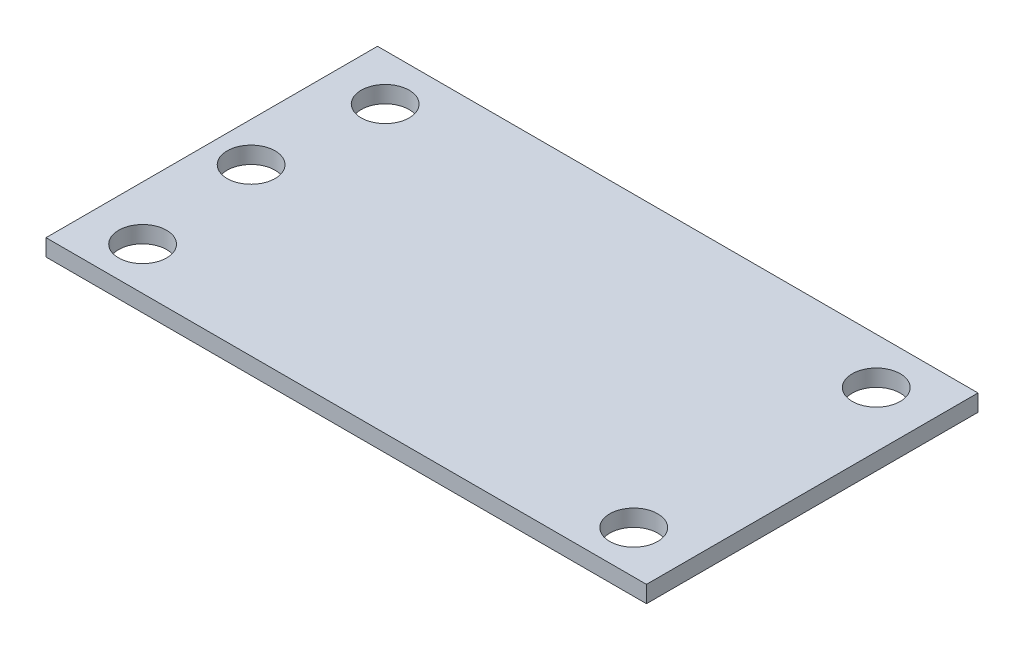
ISO-10303-21;
HEADER;
FILE_DESCRIPTION(('STEP AP214'),'2;1');
FILE_NAME('part.step','',(''),(''),'','','');
FILE_SCHEMA(('AUTOMOTIVE_DESIGN { 1 0 10303 214 1 1 1 1 }'));
ENDSEC;
DATA;
#1=APPLICATION_CONTEXT('core data for automotive mechanical design processes');
#2=APPLICATION_PROTOCOL_DEFINITION('international standard','automotive_design',2000,#1);
#3=PRODUCT_CONTEXT('',#1,'mechanical');
#4=PRODUCT('Part','Part','',(#3));
#5=PRODUCT_RELATED_PRODUCT_CATEGORY('part','',(#4));
#6=PRODUCT_DEFINITION_FORMATION('','',#4);
#7=PRODUCT_DEFINITION_CONTEXT('part definition',#1,'design');
#8=PRODUCT_DEFINITION('design','',#6,#7);
#9=PRODUCT_DEFINITION_SHAPE('','',#8);
#10=(LENGTH_UNIT() NAMED_UNIT(*) SI_UNIT(.MILLI.,.METRE.));
#11=(NAMED_UNIT(*) PLANE_ANGLE_UNIT() SI_UNIT($,.RADIAN.));
#12=(NAMED_UNIT(*) SI_UNIT($,.STERADIAN.) SOLID_ANGLE_UNIT());
#13=UNCERTAINTY_MEASURE_WITH_UNIT(LENGTH_MEASURE(1.E-05),#10,'distance_accuracy_value','');
#14=(GEOMETRIC_REPRESENTATION_CONTEXT(3) GLOBAL_UNCERTAINTY_ASSIGNED_CONTEXT((#13)) GLOBAL_UNIT_ASSIGNED_CONTEXT((#10,
#11,#12)) REPRESENTATION_CONTEXT('',''));
#15=CARTESIAN_POINT('',(0.,0.,0.));
#16=DIRECTION('',(0.,0.,1.));
#17=DIRECTION('',(1.,0.,0.));
#18=AXIS2_PLACEMENT_3D('',#15,#16,#17);
#19=CARTESIAN_POINT('',(-125.131661341035,6.99999999999999,-69.0846657224159));
#20=DIRECTION('',(1.,0.,0.));
#21=DIRECTION('',(0.,0.,-1.));
#22=AXIS2_PLACEMENT_3D('',#19,#20,#21);
#23=PLANE('',#22);
#24=DIRECTION('',(0.,0.,1.));
#25=VECTOR('',#24,1.);
#26=CARTESIAN_POINT('',(-125.131661341035,0.,-69.0846657224159));
#27=LINE('',#26,#25);
#28=CARTESIAN_POINT('',(-125.131661341035,0.,-69.0846657224159));
#29=VERTEX_POINT('',#28);
#30=CARTESIAN_POINT('',(-125.131661341035,0.,69.0846657224159));
#31=VERTEX_POINT('',#30);
#32=EDGE_CURVE('E114',#29,#31,#27,.T.);
#33=ORIENTED_EDGE('',*,*,#32,.T.);
#34=DIRECTION('',(0.,-1.,0.));
#35=VECTOR('',#34,1.);
#36=CARTESIAN_POINT('',(-125.131661341035,6.99999999999999,69.0846657224159));
#37=LINE('',#36,#35);
#38=CARTESIAN_POINT('',(-125.131661341035,6.99999999999999,69.0846657224159));
#39=VERTEX_POINT('',#38);
#40=EDGE_CURVE('E11',#39,#31,#37,.T.);
#41=ORIENTED_EDGE('',*,*,#40,.F.);
#42=DIRECTION('',(0.,0.,1.));
#43=VECTOR('',#42,1.);
#44=CARTESIAN_POINT('',(-125.131661341035,6.99999999999999,-69.0846657224159));
#45=LINE('',#44,#43);
#46=CARTESIAN_POINT('',(-125.131661341035,6.99999999999999,-69.0846657224159));
#47=VERTEX_POINT('',#46);
#48=EDGE_CURVE('E97',#47,#39,#45,.T.);
#49=ORIENTED_EDGE('',*,*,#48,.F.);
#50=DIRECTION('',(0.,-1.,0.));
#51=VECTOR('',#50,1.);
#52=CARTESIAN_POINT('',(-125.131661341035,6.99999999999999,-69.0846657224159));
#53=LINE('',#52,#51);
#54=EDGE_CURVE('E110',#47,#29,#53,.T.);
#55=ORIENTED_EDGE('',*,*,#54,.T.);
#56=EDGE_LOOP('',(#33,#41,#49,#55));
#57=FACE_BOUND('',#56,.T.);
#58=ADVANCED_FACE('F43',(#57),#23,.F.);
#59=CARTESIAN_POINT('',(125.131661341035,6.99999999999999,69.0846657224159));
#60=DIRECTION('',(0.,0.,-1.));
#61=DIRECTION('',(-1.,0.,0.));
#62=AXIS2_PLACEMENT_3D('',#59,#60,#61);
#63=PLANE('',#62);
#64=DIRECTION('',(1.,0.,0.));
#65=VECTOR('',#64,1.);
#66=CARTESIAN_POINT('',(125.131661341035,0.,69.0846657224159));
#67=LINE('',#66,#65);
#68=CARTESIAN_POINT('',(125.131661341035,0.,69.0846657224159));
#69=VERTEX_POINT('',#68);
#70=EDGE_CURVE('E102',#31,#69,#67,.T.);
#71=ORIENTED_EDGE('',*,*,#70,.T.);
#72=DIRECTION('',(0.,-1.,0.));
#73=VECTOR('',#72,1.);
#74=CARTESIAN_POINT('',(125.131661341035,6.99999999999999,69.0846657224159));
#75=LINE('',#74,#73);
#76=CARTESIAN_POINT('',(125.131661341035,6.99999999999999,69.0846657224159));
#77=VERTEX_POINT('',#76);
#78=EDGE_CURVE('E53',#77,#69,#75,.T.);
#79=ORIENTED_EDGE('',*,*,#78,.F.);
#80=DIRECTION('',(1.,0.,0.));
#81=VECTOR('',#80,1.);
#82=CARTESIAN_POINT('',(125.131661341035,6.99999999999999,69.0846657224159));
#83=LINE('',#82,#81);
#84=EDGE_CURVE('E92',#39,#77,#83,.T.);
#85=ORIENTED_EDGE('',*,*,#84,.F.);
#86=ORIENTED_EDGE('',*,*,#40,.T.);
#87=EDGE_LOOP('',(#71,#79,#85,#86));
#88=FACE_BOUND('',#87,.T.);
#89=ADVANCED_FACE('F101',(#88),#63,.F.);
#90=CARTESIAN_POINT('',(125.131661341035,6.99999999999999,-69.0846657224159));
#91=DIRECTION('',(-1.,0.,0.));
#92=DIRECTION('',(0.,0.,1.));
#93=AXIS2_PLACEMENT_3D('',#90,#91,#92);
#94=PLANE('',#93);
#95=DIRECTION('',(0.,0.,-1.));
#96=VECTOR('',#95,1.);
#97=CARTESIAN_POINT('',(125.131661341035,0.,-69.0846657224159));
#98=LINE('',#97,#96);
#99=CARTESIAN_POINT('',(125.131661341035,0.,-69.0846657224159));
#100=VERTEX_POINT('',#99);
#101=EDGE_CURVE('E79',#69,#100,#98,.T.);
#102=ORIENTED_EDGE('',*,*,#101,.T.);
#103=DIRECTION('',(0.,-1.,0.));
#104=VECTOR('',#103,1.);
#105=CARTESIAN_POINT('',(125.131661341035,6.99999999999999,-69.0846657224159));
#106=LINE('',#105,#104);
#107=CARTESIAN_POINT('',(125.131661341035,6.99999999999999,-69.0846657224159));
#108=VERTEX_POINT('',#107);
#109=EDGE_CURVE('E104',#108,#100,#106,.T.);
#110=ORIENTED_EDGE('',*,*,#109,.F.);
#111=DIRECTION('',(0.,0.,-1.));
#112=VECTOR('',#111,1.);
#113=CARTESIAN_POINT('',(125.131661341035,6.99999999999999,-69.0846657224159));
#114=LINE('',#113,#112);
#115=EDGE_CURVE('E95',#77,#108,#114,.T.);
#116=ORIENTED_EDGE('',*,*,#115,.F.);
#117=ORIENTED_EDGE('',*,*,#78,.T.);
#118=EDGE_LOOP('',(#102,#110,#116,#117));
#119=FACE_BOUND('',#118,.T.);
#120=ADVANCED_FACE('F106',(#119),#94,.F.);
#121=CARTESIAN_POINT('',(125.131661341035,6.99999999999999,-69.0846657224159));
#122=DIRECTION('',(0.,0.,1.));
#123=DIRECTION('',(1.,0.,0.));
#124=AXIS2_PLACEMENT_3D('',#121,#122,#123);
#125=PLANE('',#124);
#126=DIRECTION('',(-1.,0.,0.));
#127=VECTOR('',#126,1.);
#128=CARTESIAN_POINT('',(125.131661341035,0.,-69.0846657224159));
#129=LINE('',#128,#127);
#130=EDGE_CURVE('E85',#100,#29,#129,.T.);
#131=ORIENTED_EDGE('',*,*,#130,.T.);
#132=ORIENTED_EDGE('',*,*,#54,.F.);
#133=DIRECTION('',(-1.,0.,0.));
#134=VECTOR('',#133,1.);
#135=CARTESIAN_POINT('',(125.131661341035,6.99999999999999,-69.0846657224159));
#136=LINE('',#135,#134);
#137=EDGE_CURVE('E62',#108,#47,#136,.T.);
#138=ORIENTED_EDGE('',*,*,#137,.F.);
#139=ORIENTED_EDGE('',*,*,#109,.T.);
#140=EDGE_LOOP('',(#131,#132,#138,#139));
#141=FACE_BOUND('',#140,.T.);
#142=ADVANCED_FACE('F203',(#141),#125,.F.);
#143=CARTESIAN_POINT('',(0.,6.99999999999999,0.));
#144=DIRECTION('',(0.,-1.,0.));
#145=DIRECTION('',(0.,0.,-1.));
#146=AXIS2_PLACEMENT_3D('',#143,#144,#145);
#147=PLANE('',#146);
#148=CARTESIAN_POINT('',(-108.726788050302,6.99999999999999,0.));
#149=DIRECTION('',(0.,-1.,0.));
#150=DIRECTION('',(0.,0.,-1.));
#151=AXIS2_PLACEMENT_3D('',#148,#149,#150);
#152=CIRCLE('',#151,9.99999999999999);
#153=CARTESIAN_POINT('',(-108.726788050302,6.99999999999999,-9.99999999999999));
#154=VERTEX_POINT('',#153);
#155=EDGE_CURVE('E134',#154,#154,#152,.F.);
#156=ORIENTED_EDGE('',*,*,#155,.F.);
#157=EDGE_LOOP('',(#156));
#158=FACE_BOUND('',#157,.T.);
#159=CARTESIAN_POINT('',(-102.685331177245,6.99999999999999,51.2636376190876));
#160=DIRECTION('',(0.,-1.,0.));
#161=DIRECTION('',(0.,0.,-1.));
#162=AXIS2_PLACEMENT_3D('',#159,#160,#161);
#163=CIRCLE('',#162,9.99999999999999);
#164=CARTESIAN_POINT('',(-102.685331177245,6.99999999999999,41.2636376190876));
#165=VERTEX_POINT('',#164);
#166=EDGE_CURVE('E118',#165,#165,#163,.F.);
#167=ORIENTED_EDGE('',*,*,#166,.F.);
#168=EDGE_LOOP('',(#167));
#169=FACE_BOUND('',#168,.T.);
#170=CARTESIAN_POINT('',(101.994027262382,6.99999999999999,51.2636376190876));
#171=DIRECTION('',(0.,-1.,0.));
#172=DIRECTION('',(0.,0.,-1.));
#173=AXIS2_PLACEMENT_3D('',#170,#171,#172);
#174=CIRCLE('',#173,9.99999999999999);
#175=CARTESIAN_POINT('',(101.994027262382,6.99999999999999,41.2636376190876));
#176=VERTEX_POINT('',#175);
#177=EDGE_CURVE('E143',#176,#176,#174,.F.);
#178=ORIENTED_EDGE('',*,*,#177,.F.);
#179=EDGE_LOOP('',(#178));
#180=FACE_BOUND('',#179,.T.);
#181=CARTESIAN_POINT('',(101.994027262382,6.99999999999999,-49.826038164123));
#182=DIRECTION('',(0.,-1.,0.));
#183=DIRECTION('',(0.,0.,-1.));
#184=AXIS2_PLACEMENT_3D('',#181,#182,#183);
#185=CIRCLE('',#184,9.99999999999999);
#186=CARTESIAN_POINT('',(101.994027262382,6.99999999999999,-59.826038164123));
#187=VERTEX_POINT('',#186);
#188=EDGE_CURVE('E139',#187,#187,#185,.F.);
#189=ORIENTED_EDGE('',*,*,#188,.F.);
#190=EDGE_LOOP('',(#189));
#191=FACE_BOUND('',#190,.T.);
#192=CARTESIAN_POINT('',(-102.685331177245,6.99999999999999,-49.826038164123));
#193=DIRECTION('',(0.,-1.,0.));
#194=DIRECTION('',(0.,0.,-1.));
#195=AXIS2_PLACEMENT_3D('',#192,#193,#194);
#196=CIRCLE('',#195,9.99999999999999);
#197=CARTESIAN_POINT('',(-102.685331177245,6.99999999999999,-59.826038164123));
#198=VERTEX_POINT('',#197);
#199=EDGE_CURVE('E133',#198,#198,#196,.F.);
#200=ORIENTED_EDGE('',*,*,#199,.F.);
#201=EDGE_LOOP('',(#200));
#202=FACE_BOUND('',#201,.T.);
#203=ORIENTED_EDGE('',*,*,#48,.T.);
#204=ORIENTED_EDGE('',*,*,#84,.T.);
#205=ORIENTED_EDGE('',*,*,#115,.T.);
#206=ORIENTED_EDGE('',*,*,#137,.T.);
#207=EDGE_LOOP('',(#203,#204,#205,#206));
#208=FACE_BOUND('',#207,.T.);
#209=ADVANCED_FACE('F93',(#158,#169,#180,#191,#202,#208),#147,.F.);
#210=CARTESIAN_POINT('',(0.,0.,0.));
#211=DIRECTION('',(0.,-1.,0.));
#212=DIRECTION('',(0.,0.,-1.));
#213=AXIS2_PLACEMENT_3D('',#210,#211,#212);
#214=PLANE('',#213);
#215=CARTESIAN_POINT('',(-108.726788050302,0.,0.));
#216=DIRECTION('',(0.,-1.,0.));
#217=DIRECTION('',(0.,0.,-1.));
#218=AXIS2_PLACEMENT_3D('',#215,#216,#217);
#219=CIRCLE('',#218,9.99999999999999);
#220=CARTESIAN_POINT('',(-108.726788050302,0.,-9.99999999999999));
#221=VERTEX_POINT('',#220);
#222=EDGE_CURVE('E46',#221,#221,#219,.F.);
#223=ORIENTED_EDGE('',*,*,#222,.T.);
#224=EDGE_LOOP('',(#223));
#225=FACE_BOUND('',#224,.T.);
#226=CARTESIAN_POINT('',(-102.685331177245,0.,51.2636376190876));
#227=DIRECTION('',(0.,-1.,0.));
#228=DIRECTION('',(0.,0.,-1.));
#229=AXIS2_PLACEMENT_3D('',#226,#227,#228);
#230=CIRCLE('',#229,9.99999999999999);
#231=CARTESIAN_POINT('',(-102.685331177245,0.,41.2636376190876));
#232=VERTEX_POINT('',#231);
#233=EDGE_CURVE('E144',#232,#232,#230,.F.);
#234=ORIENTED_EDGE('',*,*,#233,.T.);
#235=EDGE_LOOP('',(#234));
#236=FACE_BOUND('',#235,.T.);
#237=CARTESIAN_POINT('',(101.994027262382,0.,51.2636376190876));
#238=DIRECTION('',(0.,-1.,0.));
#239=DIRECTION('',(0.,0.,-1.));
#240=AXIS2_PLACEMENT_3D('',#237,#238,#239);
#241=CIRCLE('',#240,9.99999999999999);
#242=CARTESIAN_POINT('',(101.994027262382,0.,41.2636376190876));
#243=VERTEX_POINT('',#242);
#244=EDGE_CURVE('E140',#243,#243,#241,.F.);
#245=ORIENTED_EDGE('',*,*,#244,.T.);
#246=EDGE_LOOP('',(#245));
#247=FACE_BOUND('',#246,.T.);
#248=CARTESIAN_POINT('',(101.994027262382,0.,-49.826038164123));
#249=DIRECTION('',(0.,-1.,0.));
#250=DIRECTION('',(0.,0.,-1.));
#251=AXIS2_PLACEMENT_3D('',#248,#249,#250);
#252=CIRCLE('',#251,9.99999999999999);
#253=CARTESIAN_POINT('',(101.994027262382,0.,-59.826038164123));
#254=VERTEX_POINT('',#253);
#255=EDGE_CURVE('E135',#254,#254,#252,.F.);
#256=ORIENTED_EDGE('',*,*,#255,.T.);
#257=EDGE_LOOP('',(#256));
#258=FACE_BOUND('',#257,.T.);
#259=CARTESIAN_POINT('',(-102.685331177245,0.,-49.826038164123));
#260=DIRECTION('',(0.,-1.,0.));
#261=DIRECTION('',(0.,0.,-1.));
#262=AXIS2_PLACEMENT_3D('',#259,#260,#261);
#263=CIRCLE('',#262,9.99999999999999);
#264=CARTESIAN_POINT('',(-102.685331177245,0.,-59.826038164123));
#265=VERTEX_POINT('',#264);
#266=EDGE_CURVE('E129',#265,#265,#263,.F.);
#267=ORIENTED_EDGE('',*,*,#266,.T.);
#268=EDGE_LOOP('',(#267));
#269=FACE_BOUND('',#268,.T.);
#270=ORIENTED_EDGE('',*,*,#32,.F.);
#271=ORIENTED_EDGE('',*,*,#130,.F.);
#272=ORIENTED_EDGE('',*,*,#101,.F.);
#273=ORIENTED_EDGE('',*,*,#70,.F.);
#274=EDGE_LOOP('',(#270,#271,#272,#273));
#275=FACE_BOUND('',#274,.T.);
#276=ADVANCED_FACE('F173',(#225,#236,#247,#258,#269,#275),#214,.T.);
#277=CARTESIAN_POINT('',(-102.685331177245,60.,-49.826038164123));
#278=DIRECTION('',(0.,-1.,0.));
#279=DIRECTION('',(0.,0.,-1.));
#280=AXIS2_PLACEMENT_3D('',#277,#278,#279);
#281=CYLINDRICAL_SURFACE('',#280,9.99999999999999);
#282=ORIENTED_EDGE('',*,*,#266,.F.);
#283=EDGE_LOOP('',(#282));
#284=FACE_BOUND('',#283,.T.);
#285=ORIENTED_EDGE('',*,*,#199,.T.);
#286=EDGE_LOOP('',(#285));
#287=FACE_BOUND('',#286,.T.);
#288=ADVANCED_FACE('F194',(#284,#287),#281,.F.);
#289=CARTESIAN_POINT('',(101.994027262382,60.,-49.826038164123));
#290=DIRECTION('',(0.,-1.,0.));
#291=DIRECTION('',(0.,0.,-1.));
#292=AXIS2_PLACEMENT_3D('',#289,#290,#291);
#293=CYLINDRICAL_SURFACE('',#292,9.99999999999999);
#294=ORIENTED_EDGE('',*,*,#255,.F.);
#295=EDGE_LOOP('',(#294));
#296=FACE_BOUND('',#295,.T.);
#297=ORIENTED_EDGE('',*,*,#188,.T.);
#298=EDGE_LOOP('',(#297));
#299=FACE_BOUND('',#298,.T.);
#300=ADVANCED_FACE('F200',(#296,#299),#293,.F.);
#301=CARTESIAN_POINT('',(101.994027262382,60.,51.2636376190876));
#302=DIRECTION('',(0.,-1.,0.));
#303=DIRECTION('',(0.,0.,-1.));
#304=AXIS2_PLACEMENT_3D('',#301,#302,#303);
#305=CYLINDRICAL_SURFACE('',#304,9.99999999999999);
#306=ORIENTED_EDGE('',*,*,#244,.F.);
#307=EDGE_LOOP('',(#306));
#308=FACE_BOUND('',#307,.T.);
#309=ORIENTED_EDGE('',*,*,#177,.T.);
#310=EDGE_LOOP('',(#309));
#311=FACE_BOUND('',#310,.T.);
#312=ADVANCED_FACE('F182',(#308,#311),#305,.F.);
#313=CARTESIAN_POINT('',(-102.685331177245,60.,51.2636376190876));
#314=DIRECTION('',(0.,-1.,0.));
#315=DIRECTION('',(0.,0.,-1.));
#316=AXIS2_PLACEMENT_3D('',#313,#314,#315);
#317=CYLINDRICAL_SURFACE('',#316,9.99999999999999);
#318=ORIENTED_EDGE('',*,*,#233,.F.);
#319=EDGE_LOOP('',(#318));
#320=FACE_BOUND('',#319,.T.);
#321=ORIENTED_EDGE('',*,*,#166,.T.);
#322=EDGE_LOOP('',(#321));
#323=FACE_BOUND('',#322,.T.);
#324=ADVANCED_FACE('F177',(#320,#323),#317,.F.);
#325=CARTESIAN_POINT('',(-108.726788050302,68.,0.));
#326=DIRECTION('',(0.,-1.,0.));
#327=DIRECTION('',(0.,0.,-1.));
#328=AXIS2_PLACEMENT_3D('',#325,#326,#327);
#329=CYLINDRICAL_SURFACE('',#328,9.99999999999999);
#330=ORIENTED_EDGE('',*,*,#222,.F.);
#331=EDGE_LOOP('',(#330));
#332=FACE_BOUND('',#331,.T.);
#333=ORIENTED_EDGE('',*,*,#155,.T.);
#334=EDGE_LOOP('',(#333));
#335=FACE_BOUND('',#334,.T.);
#336=ADVANCED_FACE('F175',(#332,#335),#329,.F.);
#337=CLOSED_SHELL('',(#58,#89,#120,#142,#209,#276,#288,#300,#312,#324,#336));
#338=MANIFOLD_SOLID_BREP('B2',#337);
#339=ADVANCED_BREP_SHAPE_REPRESENTATION('',(#18,#338),#14);
#340=SHAPE_DEFINITION_REPRESENTATION(#9,#339);
ENDSEC;
END-ISO-10303-21;
